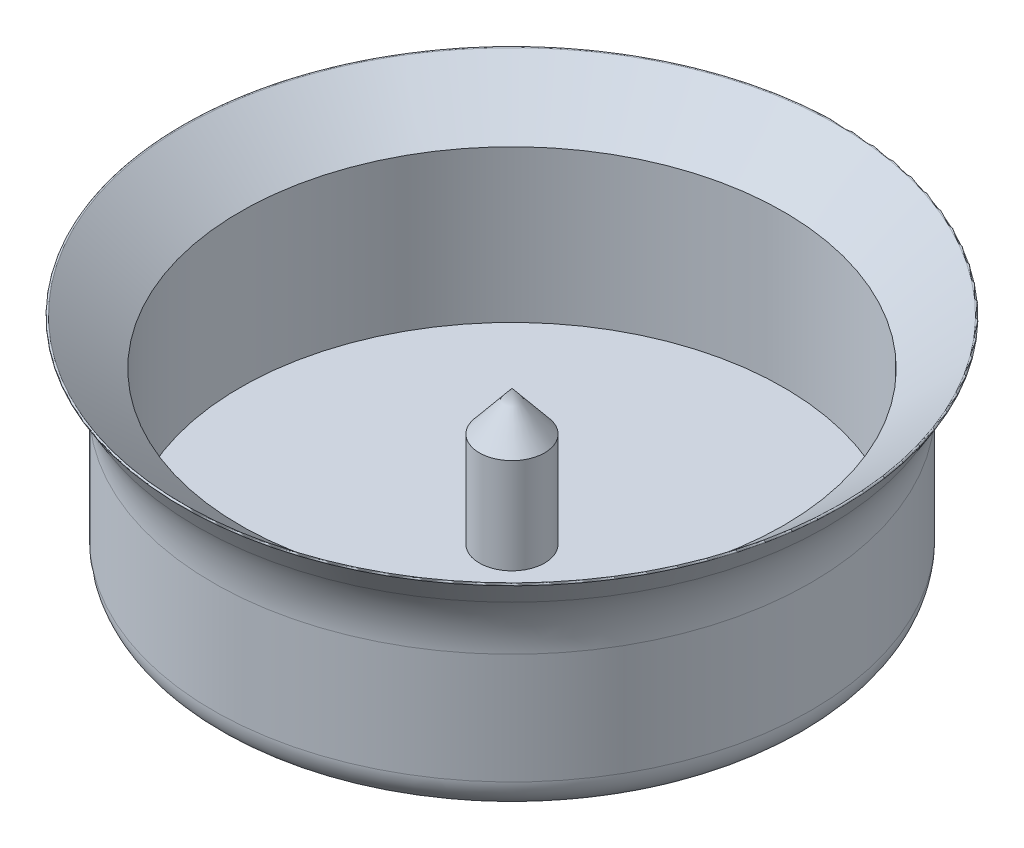
ISO-10303-21;
HEADER;
FILE_DESCRIPTION(('STEP AP214'),'2;1');
FILE_NAME('part.step','',(''),(''),'','','');
FILE_SCHEMA(('AUTOMOTIVE_DESIGN { 1 0 10303 214 1 1 1 1 }'));
ENDSEC;
DATA;
#1=APPLICATION_CONTEXT('core data for automotive mechanical design processes');
#2=APPLICATION_PROTOCOL_DEFINITION('international standard','automotive_design',2000,#1);
#3=PRODUCT_CONTEXT('',#1,'mechanical');
#4=PRODUCT('Part','Part','',(#3));
#5=PRODUCT_RELATED_PRODUCT_CATEGORY('part','',(#4));
#6=PRODUCT_DEFINITION_FORMATION('','',#4);
#7=PRODUCT_DEFINITION_CONTEXT('part definition',#1,'design');
#8=PRODUCT_DEFINITION('design','',#6,#7);
#9=PRODUCT_DEFINITION_SHAPE('','',#8);
#10=(LENGTH_UNIT() NAMED_UNIT(*) SI_UNIT(.MILLI.,.METRE.));
#11=(NAMED_UNIT(*) PLANE_ANGLE_UNIT() SI_UNIT($,.RADIAN.));
#12=(NAMED_UNIT(*) SI_UNIT($,.STERADIAN.) SOLID_ANGLE_UNIT());
#13=UNCERTAINTY_MEASURE_WITH_UNIT(LENGTH_MEASURE(1.E-05),#10,'distance_accuracy_value','');
#14=(GEOMETRIC_REPRESENTATION_CONTEXT(3) GLOBAL_UNCERTAINTY_ASSIGNED_CONTEXT((#13)) GLOBAL_UNIT_ASSIGNED_CONTEXT((#10,
#11,#12)) REPRESENTATION_CONTEXT('',''));
#15=CARTESIAN_POINT('',(0.,0.,0.));
#16=DIRECTION('',(0.,0.,1.));
#17=DIRECTION('',(1.,0.,0.));
#18=AXIS2_PLACEMENT_3D('',#15,#16,#17);
#19=CARTESIAN_POINT('',(0.,11.2850198891218,0.));
#20=DIRECTION('',(0.,-1.,0.));
#21=DIRECTION('',(1.,0.,0.));
#22=AXIS2_PLACEMENT_3D('',#19,#20,#21);
#23=CONICAL_SURFACE('',#22,3.,0.688643861685064);
#24=CARTESIAN_POINT('',(0.,14.9299602217564,0.));
#25=VERTEX_POINT('',#24);
#26=VERTEX_LOOP('',#25);
#27=FACE_BOUND('',#26,.T.);
#28=CARTESIAN_POINT('',(0.,11.2850198891218,0.));
#29=DIRECTION('',(0.,-1.,0.));
#30=DIRECTION('',(1.,0.,0.));
#31=AXIS2_PLACEMENT_3D('',#28,#29,#30);
#32=CIRCLE('',#31,3.);
#33=CARTESIAN_POINT('',(3.,11.2850198891218,0.));
#34=VERTEX_POINT('',#33);
#35=EDGE_CURVE('E65',#34,#34,#32,.T.);
#36=ORIENTED_EDGE('',*,*,#35,.F.);
#37=EDGE_LOOP('',(#36));
#38=FACE_BOUND('',#37,.T.);
#39=ADVANCED_FACE('F44',(#27,#38),#23,.T.);
#40=CARTESIAN_POINT('',(0.,0.,0.));
#41=DIRECTION('',(0.,-1.,0.));
#42=DIRECTION('',(1.,0.,0.));
#43=AXIS2_PLACEMENT_3D('',#40,#41,#42);
#44=CYLINDRICAL_SURFACE('',#43,3.);
#45=ORIENTED_EDGE('',*,*,#35,.T.);
#46=EDGE_LOOP('',(#45));
#47=FACE_BOUND('',#46,.T.);
#48=CARTESIAN_POINT('',(0.,2.5,0.));
#49=DIRECTION('',(0.,-1.,0.));
#50=DIRECTION('',(1.,0.,0.));
#51=AXIS2_PLACEMENT_3D('',#48,#49,#50);
#52=CIRCLE('',#51,3.);
#53=CARTESIAN_POINT('',(3.,2.5,0.));
#54=VERTEX_POINT('',#53);
#55=EDGE_CURVE('E66',#54,#54,#52,.T.);
#56=ORIENTED_EDGE('',*,*,#55,.F.);
#57=EDGE_LOOP('',(#56));
#58=FACE_BOUND('',#57,.T.);
#59=ADVANCED_FACE('F59',(#47,#58),#44,.T.);
#60=CARTESIAN_POINT('',(3.,2.5,0.));
#61=DIRECTION('',(0.,1.,0.));
#62=DIRECTION('',(-1.,0.,0.));
#63=AXIS2_PLACEMENT_3D('',#60,#61,#62);
#64=PLANE('',#63);
#65=ORIENTED_EDGE('',*,*,#55,.T.);
#66=EDGE_LOOP('',(#65));
#67=FACE_BOUND('',#66,.T.);
#68=CARTESIAN_POINT('',(0.,2.5,0.));
#69=DIRECTION('',(0.,-1.,0.));
#70=DIRECTION('',(1.,0.,0.));
#71=AXIS2_PLACEMENT_3D('',#68,#69,#70);
#72=CIRCLE('',#71,25.);
#73=CARTESIAN_POINT('',(25.,2.5,0.));
#74=VERTEX_POINT('',#73);
#75=EDGE_CURVE('E74',#74,#74,#72,.T.);
#76=ORIENTED_EDGE('',*,*,#75,.F.);
#77=EDGE_LOOP('',(#76));
#78=FACE_BOUND('',#77,.T.);
#79=ADVANCED_FACE('F125',(#67,#78),#64,.T.);
#80=CARTESIAN_POINT('',(0.,0.,0.));
#81=DIRECTION('',(0.,-1.,0.));
#82=DIRECTION('',(1.,0.,0.));
#83=AXIS2_PLACEMENT_3D('',#80,#81,#82);
#84=CYLINDRICAL_SURFACE('',#83,25.);
#85=ORIENTED_EDGE('',*,*,#75,.T.);
#86=EDGE_LOOP('',(#85));
#87=FACE_BOUND('',#86,.T.);
#88=CARTESIAN_POINT('',(0.,16.5,0.));
#89=DIRECTION('',(0.,-1.,0.));
#90=DIRECTION('',(1.,0.,0.));
#91=AXIS2_PLACEMENT_3D('',#88,#89,#90);
#92=CIRCLE('',#91,25.);
#93=CARTESIAN_POINT('',(25.,16.5,0.));
#94=VERTEX_POINT('',#93);
#95=EDGE_CURVE('E114',#94,#94,#92,.T.);
#96=ORIENTED_EDGE('',*,*,#95,.F.);
#97=EDGE_LOOP('',(#96));
#98=FACE_BOUND('',#97,.T.);
#99=ADVANCED_FACE('F108',(#87,#98),#84,.F.);
#100=CARTESIAN_POINT('',(0.,21.1175016937605,0.));
#101=DIRECTION('',(0.,1.,0.));
#102=DIRECTION('',(-1.,0.,0.));
#103=AXIS2_PLACEMENT_3D('',#100,#101,#102);
#104=CONICAL_SURFACE('',#103,30.6101727198654,0.882152465109833);
#105=CARTESIAN_POINT('',(0.,20.7469378585218,0.));
#106=DIRECTION('',(0.,-1.,0.));
#107=DIRECTION('',(1.,0.,0.));
#108=AXIS2_PLACEMENT_3D('',#105,#106,#107);
#109=CIRCLE('',#108,30.1599450302396);
#110=CARTESIAN_POINT('',(30.1599450302396,20.7469378585218,0.));
#111=VERTEX_POINT('',#110);
#112=EDGE_CURVE('E11',#111,#111,#109,.F.);
#113=ORIENTED_EDGE('',*,*,#112,.T.);
#114=EDGE_LOOP('',(#113));
#115=FACE_BOUND('',#114,.T.);
#116=ORIENTED_EDGE('',*,*,#95,.T.);
#117=EDGE_LOOP('',(#116));
#118=FACE_BOUND('',#117,.T.);
#119=ADVANCED_FACE('F106',(#115,#118),#104,.F.);
#120=CARTESIAN_POINT('',(0.,15.9579017244983,0.));
#121=DIRECTION('',(0.,1.,0.));
#122=DIRECTION('',(-1.,0.,0.));
#123=AXIS2_PLACEMENT_3D('',#120,#121,#122);
#124=CONICAL_SURFACE('',#123,27.5,0.54247092727467);
#125=CARTESIAN_POINT('',(0.,20.6181016291479,0.));
#126=DIRECTION('',(0.,-1.,0.));
#127=DIRECTION('',(1.,0.,0.));
#128=AXIS2_PLACEMENT_3D('',#125,#126,#127);
#129=CIRCLE('',#128,30.3091376654988);
#130=CARTESIAN_POINT('',(30.3091376654988,20.6181016291479,0.));
#131=VERTEX_POINT('',#130);
#132=EDGE_CURVE('E52',#131,#131,#129,.T.);
#133=ORIENTED_EDGE('',*,*,#132,.T.);
#134=EDGE_LOOP('',(#133));
#135=FACE_BOUND('',#134,.T.);
#136=CARTESIAN_POINT('',(0.,18.3395524264216,0.));
#137=DIRECTION('',(0.,1.,0.));
#138=DIRECTION('',(-1.,0.,0.));
#139=AXIS2_PLACEMENT_3D('',#136,#137,#138);
#140=CIRCLE('',#139,28.9356432834907);
#141=CARTESIAN_POINT('',(-28.9356432834907,18.3395524264216,0.));
#142=VERTEX_POINT('',#141);
#143=EDGE_CURVE('E72',#142,#142,#140,.T.);
#144=ORIENTED_EDGE('',*,*,#143,.T.);
#145=EDGE_LOOP('',(#144));
#146=FACE_BOUND('',#145,.T.);
#147=ADVANCED_FACE('F95',(#135,#146),#124,.T.);
#148=CARTESIAN_POINT('',(0.,0.,0.));
#149=DIRECTION('',(0.,-1.,0.));
#150=DIRECTION('',(1.,0.,0.));
#151=AXIS2_PLACEMENT_3D('',#148,#149,#150);
#152=CYLINDRICAL_SURFACE('',#151,27.5);
#153=CARTESIAN_POINT('',(0.,3.,0.));
#154=DIRECTION('',(0.,-1.,0.));
#155=DIRECTION('',(1.,0.,0.));
#156=AXIS2_PLACEMENT_3D('',#153,#154,#155);
#157=CIRCLE('',#156,27.5);
#158=CARTESIAN_POINT('',(27.5,3.,0.));
#159=VERTEX_POINT('',#158);
#160=EDGE_CURVE('E84',#159,#159,#157,.F.);
#161=ORIENTED_EDGE('',*,*,#160,.T.);
#162=EDGE_LOOP('',(#161));
#163=FACE_BOUND('',#162,.T.);
#164=CARTESIAN_POINT('',(0.,13.1770148689425,0.));
#165=DIRECTION('',(0.,-1.,0.));
#166=DIRECTION('',(1.,0.,0.));
#167=AXIS2_PLACEMENT_3D('',#164,#165,#166);
#168=CIRCLE('',#167,27.5);
#169=CARTESIAN_POINT('',(27.5,13.1770148689425,0.));
#170=VERTEX_POINT('',#169);
#171=EDGE_CURVE('E64',#170,#170,#168,.T.);
#172=ORIENTED_EDGE('',*,*,#171,.T.);
#173=EDGE_LOOP('',(#172));
#174=FACE_BOUND('',#173,.T.);
#175=ADVANCED_FACE('F139',(#163,#174),#152,.T.);
#176=CARTESIAN_POINT('',(0.,0.,0.));
#177=DIRECTION('',(0.,-1.,0.));
#178=DIRECTION('',(1.,0.,0.));
#179=AXIS2_PLACEMENT_3D('',#176,#177,#178);
#180=PLANE('',#179);
#181=CARTESIAN_POINT('',(0.,0.,0.));
#182=DIRECTION('',(0.,-1.,0.));
#183=DIRECTION('',(1.,0.,0.));
#184=AXIS2_PLACEMENT_3D('',#181,#182,#183);
#185=CIRCLE('',#184,24.5);
#186=CARTESIAN_POINT('',(24.5,0.,0.));
#187=VERTEX_POINT('',#186);
#188=EDGE_CURVE('E81',#187,#187,#185,.T.);
#189=ORIENTED_EDGE('',*,*,#188,.T.);
#190=EDGE_LOOP('',(#189));
#191=FACE_BOUND('',#190,.T.);
#192=ADVANCED_FACE('F132',(#191),#180,.T.);
#193=CARTESIAN_POINT('',(0.,13.1770148689425,0.));
#194=DIRECTION('',(0.,-1.,0.));
#195=DIRECTION('',(1.,0.,0.));
#196=AXIS2_PLACEMENT_3D('',#193,#194,#195);
#197=TOROIDAL_SURFACE('',#196,37.5,10.);
#198=ORIENTED_EDGE('',*,*,#143,.F.);
#199=EDGE_LOOP('',(#198));
#200=FACE_BOUND('',#199,.T.);
#201=ORIENTED_EDGE('',*,*,#171,.F.);
#202=EDGE_LOOP('',(#201));
#203=FACE_BOUND('',#202,.T.);
#204=ADVANCED_FACE('F105',(#200,#203),#197,.F.);
#205=CARTESIAN_POINT('',(0.,3.,0.));
#206=DIRECTION('',(0.,-1.,0.));
#207=DIRECTION('',(1.,0.,0.));
#208=AXIS2_PLACEMENT_3D('',#205,#206,#207);
#209=TOROIDAL_SURFACE('',#208,24.5,3.);
#210=ORIENTED_EDGE('',*,*,#160,.F.);
#211=EDGE_LOOP('',(#210));
#212=FACE_BOUND('',#211,.T.);
#213=ORIENTED_EDGE('',*,*,#188,.F.);
#214=EDGE_LOOP('',(#213));
#215=FACE_BOUND('',#214,.T.);
#216=ADVANCED_FACE('F96',(#212,#215),#209,.T.);
#217=CARTESIAN_POINT('',(0.,20.6697270047227,0.));
#218=DIRECTION('',(0.,1.,0.));
#219=DIRECTION('',(-1.,0.,0.));
#220=AXIS2_PLACEMENT_3D('',#217,#218,#219);
#221=TOROIDAL_SURFACE('',#220,30.2234940983337,0.1);
#222=ORIENTED_EDGE('',*,*,#112,.F.);
#223=EDGE_LOOP('',(#222));
#224=FACE_BOUND('',#223,.T.);
#225=ORIENTED_EDGE('',*,*,#132,.F.);
#226=EDGE_LOOP('',(#225));
#227=FACE_BOUND('',#226,.T.);
#228=ADVANCED_FACE('F50',(#224,#227),#221,.T.);
#229=CLOSED_SHELL('',(#39,#59,#79,#99,#119,#147,#175,#192,#204,#216,#228));
#230=MANIFOLD_SOLID_BREP('B2',#229);
#231=ADVANCED_BREP_SHAPE_REPRESENTATION('',(#18,#230),#14);
#232=SHAPE_DEFINITION_REPRESENTATION(#9,#231);
ENDSEC;
END-ISO-10303-21;
